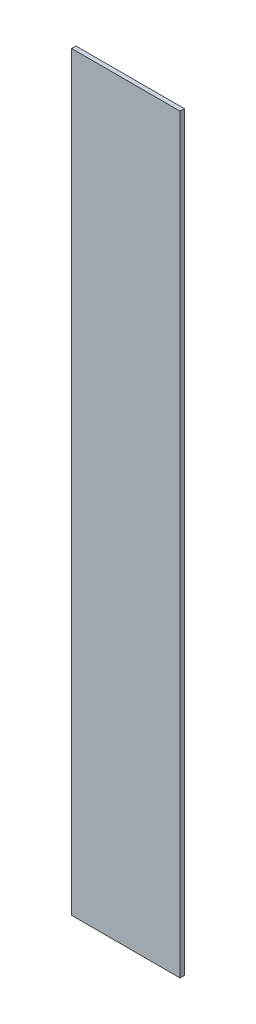
ISO-10303-21;
HEADER;
FILE_DESCRIPTION(('STEP AP214'),'2;1');
FILE_NAME('part.step','',(''),(''),'','','');
FILE_SCHEMA(('AUTOMOTIVE_DESIGN { 1 0 10303 214 1 1 1 1 }'));
ENDSEC;
DATA;
#1=APPLICATION_CONTEXT('core data for automotive mechanical design processes');
#2=APPLICATION_PROTOCOL_DEFINITION('international standard','automotive_design',2000,#1);
#3=PRODUCT_CONTEXT('',#1,'mechanical');
#4=PRODUCT('Part','Part','',(#3));
#5=PRODUCT_RELATED_PRODUCT_CATEGORY('part','',(#4));
#6=PRODUCT_DEFINITION_FORMATION('','',#4);
#7=PRODUCT_DEFINITION_CONTEXT('part definition',#1,'design');
#8=PRODUCT_DEFINITION('design','',#6,#7);
#9=PRODUCT_DEFINITION_SHAPE('','',#8);
#10=(LENGTH_UNIT() NAMED_UNIT(*) SI_UNIT(.MILLI.,.METRE.));
#11=(NAMED_UNIT(*) PLANE_ANGLE_UNIT() SI_UNIT($,.RADIAN.));
#12=(NAMED_UNIT(*) SI_UNIT($,.STERADIAN.) SOLID_ANGLE_UNIT());
#13=UNCERTAINTY_MEASURE_WITH_UNIT(LENGTH_MEASURE(1.E-05),#10,'distance_accuracy_value','');
#14=(GEOMETRIC_REPRESENTATION_CONTEXT(3) GLOBAL_UNCERTAINTY_ASSIGNED_CONTEXT((#13)) GLOBAL_UNIT_ASSIGNED_CONTEXT((#10,
#11,#12)) REPRESENTATION_CONTEXT('',''));
#15=CARTESIAN_POINT('',(0.,0.,0.));
#16=DIRECTION('',(0.,0.,1.));
#17=DIRECTION('',(1.,0.,0.));
#18=AXIS2_PLACEMENT_3D('',#15,#16,#17);
#19=CARTESIAN_POINT('',(25.,-196.039984012787,0.999999999999996));
#20=DIRECTION('',(0.,0.,1.));
#21=DIRECTION('',(1.,0.,0.));
#22=AXIS2_PLACEMENT_3D('',#19,#20,#21);
#23=PLANE('',#22);
#24=DIRECTION('',(0.,1.,0.));
#25=VECTOR('',#24,1.);
#26=CARTESIAN_POINT('',(-25.,-196.039984012787,1.));
#27=LINE('',#26,#25);
#28=CARTESIAN_POINT('',(-25.,-146.,1.));
#29=VERTEX_POINT('',#28);
#30=CARTESIAN_POINT('',(-25.,200.,1.));
#31=VERTEX_POINT('',#30);
#32=EDGE_CURVE('E74',#29,#31,#27,.T.);
#33=ORIENTED_EDGE('',*,*,#32,.F.);
#34=DIRECTION('',(1.,0.,0.));
#35=VECTOR('',#34,1.);
#36=CARTESIAN_POINT('',(25.,-146.,0.999999999999996));
#37=LINE('',#36,#35);
#38=CARTESIAN_POINT('',(25.,-146.,0.999999999999996));
#39=VERTEX_POINT('',#38);
#40=EDGE_CURVE('E100',#29,#39,#37,.T.);
#41=ORIENTED_EDGE('',*,*,#40,.T.);
#42=DIRECTION('',(0.,1.,0.));
#43=VECTOR('',#42,1.);
#44=CARTESIAN_POINT('',(25.,-196.039984012787,0.999999999999996));
#45=LINE('',#44,#43);
#46=CARTESIAN_POINT('',(25.,200.,0.999999999999996));
#47=VERTEX_POINT('',#46);
#48=EDGE_CURVE('E80',#39,#47,#45,.T.);
#49=ORIENTED_EDGE('',*,*,#48,.T.);
#50=DIRECTION('',(1.,0.,0.));
#51=VECTOR('',#50,1.);
#52=CARTESIAN_POINT('',(25.,200.,0.999999999999996));
#53=LINE('',#52,#51);
#54=EDGE_CURVE('E84',#31,#47,#53,.T.);
#55=ORIENTED_EDGE('',*,*,#54,.F.);
#56=EDGE_LOOP('',(#33,#41,#49,#55));
#57=FACE_BOUND('',#56,.T.);
#58=ADVANCED_FACE('F36',(#57),#23,.T.);
#59=CARTESIAN_POINT('',(25.,-196.039984012787,0.999999999999996));
#60=DIRECTION('',(1.,0.,0.));
#61=DIRECTION('',(0.,0.,-1.));
#62=AXIS2_PLACEMENT_3D('',#59,#60,#61);
#63=PLANE('',#62);
#64=ORIENTED_EDGE('',*,*,#48,.F.);
#65=DIRECTION('',(0.,0.,-1.));
#66=VECTOR('',#65,1.);
#67=CARTESIAN_POINT('',(25.,-146.,0.999999999999994));
#68=LINE('',#67,#66);
#69=CARTESIAN_POINT('',(25.0000000000002,-146.,-1.00000000000002));
#70=VERTEX_POINT('',#69);
#71=EDGE_CURVE('E104',#39,#70,#68,.T.);
#72=ORIENTED_EDGE('',*,*,#71,.T.);
#73=DIRECTION('',(0.,1.,0.));
#74=VECTOR('',#73,1.);
#75=CARTESIAN_POINT('',(25.,-196.039984012787,-1.));
#76=LINE('',#75,#74);
#77=CARTESIAN_POINT('',(25.,200.,-1.));
#78=VERTEX_POINT('',#77);
#79=EDGE_CURVE('E101',#70,#78,#76,.T.);
#80=ORIENTED_EDGE('',*,*,#79,.T.);
#81=DIRECTION('',(0.,0.,-1.));
#82=VECTOR('',#81,1.);
#83=CARTESIAN_POINT('',(25.,200.,0.999999999999996));
#84=LINE('',#83,#82);
#85=EDGE_CURVE('E89',#47,#78,#84,.T.);
#86=ORIENTED_EDGE('',*,*,#85,.F.);
#87=EDGE_LOOP('',(#64,#72,#80,#86));
#88=FACE_BOUND('',#87,.T.);
#89=ADVANCED_FACE('F109',(#88),#63,.T.);
#90=CARTESIAN_POINT('',(25.,-196.039984012787,-1.));
#91=DIRECTION('',(0.,0.,-1.));
#92=DIRECTION('',(-1.,0.,0.));
#93=AXIS2_PLACEMENT_3D('',#90,#91,#92);
#94=PLANE('',#93);
#95=ORIENTED_EDGE('',*,*,#79,.F.);
#96=DIRECTION('',(-1.,0.,0.));
#97=VECTOR('',#96,1.);
#98=CARTESIAN_POINT('',(25.,-146.,-1.));
#99=LINE('',#98,#97);
#100=CARTESIAN_POINT('',(-25.,-146.,-1.00000000000002));
#101=VERTEX_POINT('',#100);
#102=EDGE_CURVE('E40',#70,#101,#99,.T.);
#103=ORIENTED_EDGE('',*,*,#102,.T.);
#104=DIRECTION('',(0.,1.,0.));
#105=VECTOR('',#104,1.);
#106=CARTESIAN_POINT('',(-25.,-196.039984012787,-0.999999999999997));
#107=LINE('',#106,#105);
#108=CARTESIAN_POINT('',(-25.,200.,-0.999999999999997));
#109=VERTEX_POINT('',#108);
#110=EDGE_CURVE('E98',#101,#109,#107,.T.);
#111=ORIENTED_EDGE('',*,*,#110,.T.);
#112=DIRECTION('',(-1.,0.,0.));
#113=VECTOR('',#112,1.);
#114=CARTESIAN_POINT('',(25.,200.,-1.));
#115=LINE('',#114,#113);
#116=EDGE_CURVE('E81',#78,#109,#115,.T.);
#117=ORIENTED_EDGE('',*,*,#116,.F.);
#118=EDGE_LOOP('',(#95,#103,#111,#117));
#119=FACE_BOUND('',#118,.T.);
#120=ADVANCED_FACE('F108',(#119),#94,.T.);
#121=CARTESIAN_POINT('',(-25.,-196.039984012787,1.));
#122=DIRECTION('',(-1.,0.,0.));
#123=DIRECTION('',(0.,0.,1.));
#124=AXIS2_PLACEMENT_3D('',#121,#122,#123);
#125=PLANE('',#124);
#126=ORIENTED_EDGE('',*,*,#110,.F.);
#127=DIRECTION('',(0.,0.,1.));
#128=VECTOR('',#127,1.);
#129=CARTESIAN_POINT('',(-25.,-146.,1.));
#130=LINE('',#129,#128);
#131=EDGE_CURVE('E11',#101,#29,#130,.T.);
#132=ORIENTED_EDGE('',*,*,#131,.T.);
#133=ORIENTED_EDGE('',*,*,#32,.T.);
#134=DIRECTION('',(0.,0.,1.));
#135=VECTOR('',#134,1.);
#136=CARTESIAN_POINT('',(-25.,200.,1.));
#137=LINE('',#136,#135);
#138=EDGE_CURVE('E77',#109,#31,#137,.T.);
#139=ORIENTED_EDGE('',*,*,#138,.F.);
#140=EDGE_LOOP('',(#126,#132,#133,#139));
#141=FACE_BOUND('',#140,.T.);
#142=ADVANCED_FACE('F38',(#141),#125,.T.);
#143=CARTESIAN_POINT('',(47.3606797749981,-146.,6.99999999999997));
#144=DIRECTION('',(0.,-1.,0.));
#145=DIRECTION('',(0.,0.,-1.));
#146=AXIS2_PLACEMENT_3D('',#143,#144,#145);
#147=PLANE('',#146);
#148=ORIENTED_EDGE('',*,*,#102,.F.);
#149=ORIENTED_EDGE('',*,*,#71,.F.);
#150=ORIENTED_EDGE('',*,*,#40,.F.);
#151=ORIENTED_EDGE('',*,*,#131,.F.);
#152=EDGE_LOOP('',(#148,#149,#150,#151));
#153=FACE_BOUND('',#152,.T.);
#154=ADVANCED_FACE('F110',(#153),#147,.T.);
#155=CARTESIAN_POINT('',(0.,200.,0.));
#156=DIRECTION('',(0.,1.,0.));
#157=DIRECTION('',(0.,0.,1.));
#158=AXIS2_PLACEMENT_3D('',#155,#156,#157);
#159=PLANE('',#158);
#160=ORIENTED_EDGE('',*,*,#138,.T.);
#161=ORIENTED_EDGE('',*,*,#54,.T.);
#162=ORIENTED_EDGE('',*,*,#85,.T.);
#163=ORIENTED_EDGE('',*,*,#116,.T.);
#164=EDGE_LOOP('',(#160,#161,#162,#163));
#165=FACE_BOUND('',#164,.T.);
#166=ADVANCED_FACE('F92',(#165),#159,.T.);
#167=CLOSED_SHELL('',(#58,#89,#120,#142,#154,#166));
#168=MANIFOLD_SOLID_BREP('B2',#167);
#169=ADVANCED_BREP_SHAPE_REPRESENTATION('',(#18,#168),#14);
#170=SHAPE_DEFINITION_REPRESENTATION(#9,#169);
ENDSEC;
END-ISO-10303-21;
